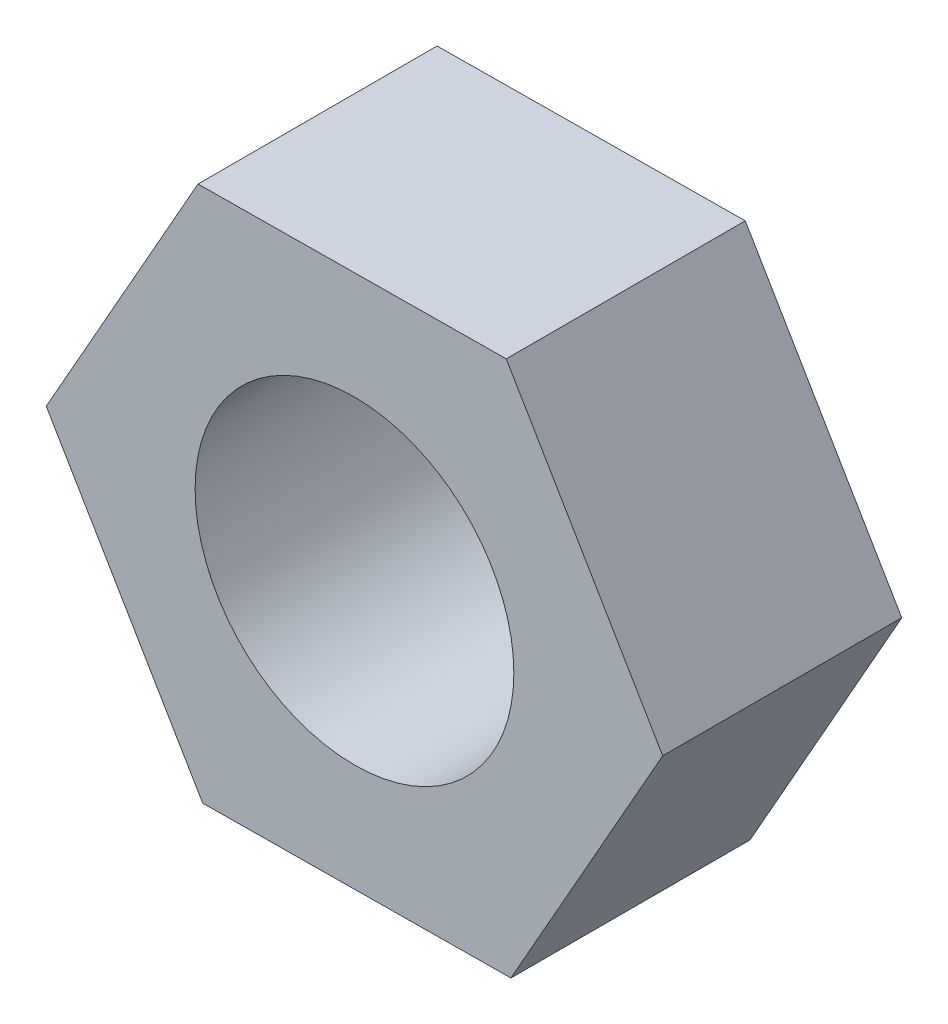
ISO-10303-21;
HEADER;
FILE_DESCRIPTION(('STEP AP214'),'2;1');
FILE_NAME('part.step','',(''),(''),'','','');
FILE_SCHEMA(('AUTOMOTIVE_DESIGN { 1 0 10303 214 1 1 1 1 }'));
ENDSEC;
DATA;
#1=APPLICATION_CONTEXT('core data for automotive mechanical design processes');
#2=APPLICATION_PROTOCOL_DEFINITION('international standard','automotive_design',2000,#1);
#3=PRODUCT_CONTEXT('',#1,'mechanical');
#4=PRODUCT('Part','Part','',(#3));
#5=PRODUCT_RELATED_PRODUCT_CATEGORY('part','',(#4));
#6=PRODUCT_DEFINITION_FORMATION('','',#4);
#7=PRODUCT_DEFINITION_CONTEXT('part definition',#1,'design');
#8=PRODUCT_DEFINITION('design','',#6,#7);
#9=PRODUCT_DEFINITION_SHAPE('','',#8);
#10=(LENGTH_UNIT() NAMED_UNIT(*) SI_UNIT(.MILLI.,.METRE.));
#11=(NAMED_UNIT(*) PLANE_ANGLE_UNIT() SI_UNIT($,.RADIAN.));
#12=(NAMED_UNIT(*) SI_UNIT($,.STERADIAN.) SOLID_ANGLE_UNIT());
#13=UNCERTAINTY_MEASURE_WITH_UNIT(LENGTH_MEASURE(1.E-05),#10,'distance_accuracy_value','');
#14=(GEOMETRIC_REPRESENTATION_CONTEXT(3) GLOBAL_UNCERTAINTY_ASSIGNED_CONTEXT((#13)) GLOBAL_UNIT_ASSIGNED_CONTEXT((#10,
#11,#12)) REPRESENTATION_CONTEXT('',''));
#15=CARTESIAN_POINT('',(0.,0.,0.));
#16=DIRECTION('',(0.,0.,1.));
#17=DIRECTION('',(1.,0.,0.));
#18=AXIS2_PLACEMENT_3D('',#15,#16,#17);
#19=CARTESIAN_POINT('',(0.,0.,3.));
#20=DIRECTION('',(0.,0.,1.));
#21=DIRECTION('',(1.,0.,0.));
#22=AXIS2_PLACEMENT_3D('',#19,#20,#21);
#23=PLANE('',#22);
#24=DIRECTION('',(0.999961257640527,0.00880245522430721,0.));
#25=VECTOR('',#24,1.);
#26=CARTESIAN_POINT('',(-1.90456024427971,-3.36689524773827,3.));
#27=LINE('',#26,#25);
#28=CARTESIAN_POINT('',(-1.90456024427971,-3.36689524773827,3.));
#29=VERTEX_POINT('',#28);
#30=CARTESIAN_POINT('',(1.96353669428258,-3.33284517845327,3.));
#31=VERTEX_POINT('',#30);
#32=EDGE_CURVE('E131',#29,#31,#27,.T.);
#33=ORIENTED_EDGE('',*,*,#32,.T.);
#34=DIRECTION('',(0.492357478980338,0.870393079529086,0.));
#35=VECTOR('',#34,1.);
#36=CARTESIAN_POINT('',(1.96353669428258,-3.33284517845327,3.));
#37=LINE('',#36,#35);
#38=CARTESIAN_POINT('',(3.8680969385623,0.0340500692849943,3.));
#39=VERTEX_POINT('',#38);
#40=EDGE_CURVE('E89',#31,#39,#37,.T.);
#41=ORIENTED_EDGE('',*,*,#40,.T.);
#42=DIRECTION('',(-0.507603778660189,0.861590624304779,0.));
#43=VECTOR('',#42,1.);
#44=CARTESIAN_POINT('',(3.8680969385623,0.0340500692849943,3.));
#45=LINE('',#44,#43);
#46=CARTESIAN_POINT('',(1.90456024427971,3.36689524773827,3.));
#47=VERTEX_POINT('',#46);
#48=EDGE_CURVE('E102',#39,#47,#45,.T.);
#49=ORIENTED_EDGE('',*,*,#48,.T.);
#50=DIRECTION('',(-0.999961257640527,-0.00880245522430722,0.));
#51=VECTOR('',#50,1.);
#52=CARTESIAN_POINT('',(1.90456024427971,3.36689524773827,3.));
#53=LINE('',#52,#51);
#54=CARTESIAN_POINT('',(-1.96353669428257,3.33284517845327,3.));
#55=VERTEX_POINT('',#54);
#56=EDGE_CURVE('E96',#47,#55,#53,.T.);
#57=ORIENTED_EDGE('',*,*,#56,.T.);
#58=DIRECTION('',(-0.492357478980338,-0.870393079529086,0.));
#59=VECTOR('',#58,1.);
#60=CARTESIAN_POINT('',(-1.96353669428257,3.33284517845327,3.));
#61=LINE('',#60,#59);
#62=CARTESIAN_POINT('',(-3.86809693856229,-0.0340500692849975,3.));
#63=VERTEX_POINT('',#62);
#64=EDGE_CURVE('E100',#55,#63,#61,.T.);
#65=ORIENTED_EDGE('',*,*,#64,.T.);
#66=DIRECTION('',(0.507603778660189,-0.861590624304779,0.));
#67=VECTOR('',#66,1.);
#68=CARTESIAN_POINT('',(-3.86809693856229,-0.0340500692849975,3.));
#69=LINE('',#68,#67);
#70=EDGE_CURVE('E52',#63,#29,#69,.T.);
#71=ORIENTED_EDGE('',*,*,#70,.T.);
#72=EDGE_LOOP('',(#33,#41,#49,#57,#65,#71));
#73=FACE_BOUND('',#72,.T.);
#74=CARTESIAN_POINT('',(0.,0.,3.));
#75=DIRECTION('',(0.,0.,1.));
#76=DIRECTION('',(1.,0.,0.));
#77=AXIS2_PLACEMENT_3D('',#74,#75,#76);
#78=CIRCLE('',#77,2.);
#79=CARTESIAN_POINT('',(2.,0.,3.));
#80=VERTEX_POINT('',#79);
#81=EDGE_CURVE('E124',#80,#80,#78,.T.);
#82=ORIENTED_EDGE('',*,*,#81,.F.);
#83=EDGE_LOOP('',(#82));
#84=FACE_BOUND('',#83,.T.);
#85=ADVANCED_FACE('F35',(#73,#84),#23,.T.);
#86=CARTESIAN_POINT('',(0.,0.,0.));
#87=DIRECTION('',(0.,0.,1.));
#88=DIRECTION('',(1.,0.,0.));
#89=AXIS2_PLACEMENT_3D('',#86,#87,#88);
#90=PLANE('',#89);
#91=DIRECTION('',(0.999961257640527,0.00880245522430721,0.));
#92=VECTOR('',#91,1.);
#93=CARTESIAN_POINT('',(-1.90456024427971,-3.36689524773827,0.));
#94=LINE('',#93,#92);
#95=CARTESIAN_POINT('',(-1.90456024427971,-3.36689524773827,0.));
#96=VERTEX_POINT('',#95);
#97=CARTESIAN_POINT('',(1.96353669428258,-3.33284517845327,0.));
#98=VERTEX_POINT('',#97);
#99=EDGE_CURVE('E120',#96,#98,#94,.T.);
#100=ORIENTED_EDGE('',*,*,#99,.F.);
#101=DIRECTION('',(0.507603778660189,-0.861590624304779,0.));
#102=VECTOR('',#101,1.);
#103=CARTESIAN_POINT('',(-3.86809693856229,-0.0340500692849975,0.));
#104=LINE('',#103,#102);
#105=CARTESIAN_POINT('',(-3.86809693856229,-0.0340500692849975,0.));
#106=VERTEX_POINT('',#105);
#107=EDGE_CURVE('E81',#106,#96,#104,.T.);
#108=ORIENTED_EDGE('',*,*,#107,.F.);
#109=DIRECTION('',(-0.492357478980338,-0.870393079529086,0.));
#110=VECTOR('',#109,1.);
#111=CARTESIAN_POINT('',(-1.96353669428257,3.33284517845327,0.));
#112=LINE('',#111,#110);
#113=CARTESIAN_POINT('',(-1.96353669428257,3.33284517845327,0.));
#114=VERTEX_POINT('',#113);
#115=EDGE_CURVE('E75',#114,#106,#112,.T.);
#116=ORIENTED_EDGE('',*,*,#115,.F.);
#117=DIRECTION('',(-0.999961257640527,-0.00880245522430722,0.));
#118=VECTOR('',#117,1.);
#119=CARTESIAN_POINT('',(1.90456024427971,3.36689524773827,0.));
#120=LINE('',#119,#118);
#121=CARTESIAN_POINT('',(1.90456024427971,3.36689524773827,0.));
#122=VERTEX_POINT('',#121);
#123=EDGE_CURVE('E110',#122,#114,#120,.T.);
#124=ORIENTED_EDGE('',*,*,#123,.F.);
#125=DIRECTION('',(-0.507603778660189,0.861590624304779,0.));
#126=VECTOR('',#125,1.);
#127=CARTESIAN_POINT('',(3.8680969385623,0.0340500692849943,0.));
#128=LINE('',#127,#126);
#129=CARTESIAN_POINT('',(3.8680969385623,0.0340500692849943,0.));
#130=VERTEX_POINT('',#129);
#131=EDGE_CURVE('E126',#130,#122,#128,.T.);
#132=ORIENTED_EDGE('',*,*,#131,.F.);
#133=DIRECTION('',(0.492357478980338,0.870393079529086,0.));
#134=VECTOR('',#133,1.);
#135=CARTESIAN_POINT('',(1.96353669428258,-3.33284517845327,0.));
#136=LINE('',#135,#134);
#137=EDGE_CURVE('E123',#98,#130,#136,.T.);
#138=ORIENTED_EDGE('',*,*,#137,.F.);
#139=EDGE_LOOP('',(#100,#108,#116,#124,#132,#138));
#140=FACE_BOUND('',#139,.T.);
#141=CARTESIAN_POINT('',(0.,0.,0.));
#142=DIRECTION('',(0.,0.,1.));
#143=DIRECTION('',(1.,0.,0.));
#144=AXIS2_PLACEMENT_3D('',#141,#142,#143);
#145=CIRCLE('',#144,2.);
#146=CARTESIAN_POINT('',(2.,0.,0.));
#147=VERTEX_POINT('',#146);
#148=EDGE_CURVE('E224',#147,#147,#145,.T.);
#149=ORIENTED_EDGE('',*,*,#148,.T.);
#150=EDGE_LOOP('',(#149));
#151=FACE_BOUND('',#150,.T.);
#152=ADVANCED_FACE('F140',(#140,#151),#90,.F.);
#153=CARTESIAN_POINT('',(-1.90456024427971,-3.36689524773827,3.));
#154=DIRECTION('',(-0.00880245522430721,0.999961257640527,0.));
#155=DIRECTION('',(-0.999961257640527,-0.00880245522430721,0.));
#156=AXIS2_PLACEMENT_3D('',#153,#154,#155);
#157=PLANE('',#156);
#158=ORIENTED_EDGE('',*,*,#99,.T.);
#159=DIRECTION('',(0.,0.,-1.));
#160=VECTOR('',#159,1.);
#161=CARTESIAN_POINT('',(1.96353669428258,-3.33284517845327,3.));
#162=LINE('',#161,#160);
#163=EDGE_CURVE('E11',#31,#98,#162,.T.);
#164=ORIENTED_EDGE('',*,*,#163,.F.);
#165=ORIENTED_EDGE('',*,*,#32,.F.);
#166=DIRECTION('',(0.,0.,-1.));
#167=VECTOR('',#166,1.);
#168=CARTESIAN_POINT('',(-1.90456024427971,-3.36689524773827,3.));
#169=LINE('',#168,#167);
#170=EDGE_CURVE('E116',#29,#96,#169,.T.);
#171=ORIENTED_EDGE('',*,*,#170,.T.);
#172=EDGE_LOOP('',(#158,#164,#165,#171));
#173=FACE_BOUND('',#172,.T.);
#174=ADVANCED_FACE('F37',(#173),#157,.F.);
#175=CARTESIAN_POINT('',(1.96353669428258,-3.33284517845327,3.));
#176=DIRECTION('',(-0.870393079529086,0.492357478980338,0.));
#177=DIRECTION('',(-0.492357478980338,-0.870393079529086,0.));
#178=AXIS2_PLACEMENT_3D('',#175,#176,#177);
#179=PLANE('',#178);
#180=ORIENTED_EDGE('',*,*,#137,.T.);
#181=DIRECTION('',(0.,0.,-1.));
#182=VECTOR('',#181,1.);
#183=CARTESIAN_POINT('',(3.8680969385623,0.0340500692849943,3.));
#184=LINE('',#183,#182);
#185=EDGE_CURVE('E44',#39,#130,#184,.T.);
#186=ORIENTED_EDGE('',*,*,#185,.F.);
#187=ORIENTED_EDGE('',*,*,#40,.F.);
#188=ORIENTED_EDGE('',*,*,#163,.T.);
#189=EDGE_LOOP('',(#180,#186,#187,#188));
#190=FACE_BOUND('',#189,.T.);
#191=ADVANCED_FACE('F165',(#190),#179,.F.);
#192=CARTESIAN_POINT('',(3.8680969385623,0.0340500692849943,3.));
#193=DIRECTION('',(-0.861590624304779,-0.507603778660189,0.));
#194=DIRECTION('',(0.507603778660189,-0.861590624304779,0.));
#195=AXIS2_PLACEMENT_3D('',#192,#193,#194);
#196=PLANE('',#195);
#197=ORIENTED_EDGE('',*,*,#131,.T.);
#198=DIRECTION('',(0.,0.,-1.));
#199=VECTOR('',#198,1.);
#200=CARTESIAN_POINT('',(1.90456024427971,3.36689524773827,3.));
#201=LINE('',#200,#199);
#202=EDGE_CURVE('E111',#47,#122,#201,.T.);
#203=ORIENTED_EDGE('',*,*,#202,.F.);
#204=ORIENTED_EDGE('',*,*,#48,.F.);
#205=ORIENTED_EDGE('',*,*,#185,.T.);
#206=EDGE_LOOP('',(#197,#203,#204,#205));
#207=FACE_BOUND('',#206,.T.);
#208=ADVANCED_FACE('F137',(#207),#196,.F.);
#209=CARTESIAN_POINT('',(1.90456024427971,3.36689524773827,3.));
#210=DIRECTION('',(0.00880245522430722,-0.999961257640527,0.));
#211=DIRECTION('',(0.999961257640527,0.00880245522430722,0.));
#212=AXIS2_PLACEMENT_3D('',#209,#210,#211);
#213=PLANE('',#212);
#214=ORIENTED_EDGE('',*,*,#123,.T.);
#215=DIRECTION('',(0.,0.,-1.));
#216=VECTOR('',#215,1.);
#217=CARTESIAN_POINT('',(-1.96353669428257,3.33284517845327,3.));
#218=LINE('',#217,#216);
#219=EDGE_CURVE('E107',#55,#114,#218,.T.);
#220=ORIENTED_EDGE('',*,*,#219,.F.);
#221=ORIENTED_EDGE('',*,*,#56,.F.);
#222=ORIENTED_EDGE('',*,*,#202,.T.);
#223=EDGE_LOOP('',(#214,#220,#221,#222));
#224=FACE_BOUND('',#223,.T.);
#225=ADVANCED_FACE('F108',(#224),#213,.F.);
#226=CARTESIAN_POINT('',(-1.96353669428257,3.33284517845327,3.));
#227=DIRECTION('',(0.870393079529086,-0.492357478980338,0.));
#228=DIRECTION('',(0.492357478980338,0.870393079529086,0.));
#229=AXIS2_PLACEMENT_3D('',#226,#227,#228);
#230=PLANE('',#229);
#231=ORIENTED_EDGE('',*,*,#115,.T.);
#232=DIRECTION('',(0.,0.,-1.));
#233=VECTOR('',#232,1.);
#234=CARTESIAN_POINT('',(-3.86809693856229,-0.0340500692849975,3.));
#235=LINE('',#234,#233);
#236=EDGE_CURVE('E112',#63,#106,#235,.T.);
#237=ORIENTED_EDGE('',*,*,#236,.F.);
#238=ORIENTED_EDGE('',*,*,#64,.F.);
#239=ORIENTED_EDGE('',*,*,#219,.T.);
#240=EDGE_LOOP('',(#231,#237,#238,#239));
#241=FACE_BOUND('',#240,.T.);
#242=ADVANCED_FACE('F114',(#241),#230,.F.);
#243=CARTESIAN_POINT('',(-3.86809693856229,-0.0340500692849975,3.));
#244=DIRECTION('',(0.861590624304779,0.507603778660189,0.));
#245=DIRECTION('',(-0.507603778660189,0.861590624304779,0.));
#246=AXIS2_PLACEMENT_3D('',#243,#244,#245);
#247=PLANE('',#246);
#248=ORIENTED_EDGE('',*,*,#107,.T.);
#249=ORIENTED_EDGE('',*,*,#170,.F.);
#250=ORIENTED_EDGE('',*,*,#70,.F.);
#251=ORIENTED_EDGE('',*,*,#236,.T.);
#252=EDGE_LOOP('',(#248,#249,#250,#251));
#253=FACE_BOUND('',#252,.T.);
#254=ADVANCED_FACE('F145',(#253),#247,.F.);
#255=CARTESIAN_POINT('',(0.,0.,3.));
#256=DIRECTION('',(0.,0.,-1.));
#257=DIRECTION('',(-1.,0.,0.));
#258=AXIS2_PLACEMENT_3D('',#255,#256,#257);
#259=CYLINDRICAL_SURFACE('',#258,2.);
#260=ORIENTED_EDGE('',*,*,#81,.T.);
#261=EDGE_LOOP('',(#260));
#262=FACE_BOUND('',#261,.T.);
#263=ORIENTED_EDGE('',*,*,#148,.F.);
#264=EDGE_LOOP('',(#263));
#265=FACE_BOUND('',#264,.T.);
#266=ADVANCED_FACE('F147',(#262,#265),#259,.F.);
#267=CLOSED_SHELL('',(#85,#152,#174,#191,#208,#225,#242,#254,#266));
#268=MANIFOLD_SOLID_BREP('B2',#267);
#269=ADVANCED_BREP_SHAPE_REPRESENTATION('',(#18,#268),#14);
#270=SHAPE_DEFINITION_REPRESENTATION(#9,#269);
ENDSEC;
END-ISO-10303-21;
